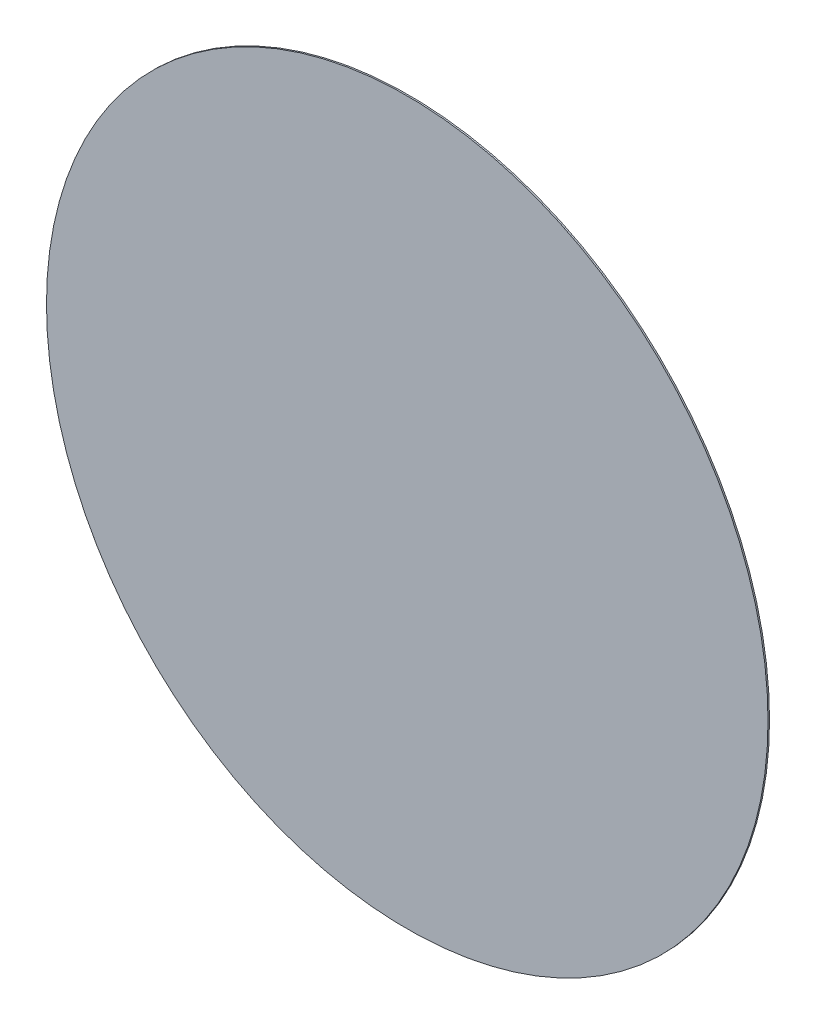
ISO-10303-21;
HEADER;
FILE_DESCRIPTION(('STEP AP214'),'2;1');
FILE_NAME('part.step','',(''),(''),'','','');
FILE_SCHEMA(('AUTOMOTIVE_DESIGN { 1 0 10303 214 1 1 1 1 }'));
ENDSEC;
DATA;
#1=APPLICATION_CONTEXT('core data for automotive mechanical design processes');
#2=APPLICATION_PROTOCOL_DEFINITION('international standard','automotive_design',2000,#1);
#3=PRODUCT_CONTEXT('',#1,'mechanical');
#4=PRODUCT('Part','Part','',(#3));
#5=PRODUCT_RELATED_PRODUCT_CATEGORY('part','',(#4));
#6=PRODUCT_DEFINITION_FORMATION('','',#4);
#7=PRODUCT_DEFINITION_CONTEXT('part definition',#1,'design');
#8=PRODUCT_DEFINITION('design','',#6,#7);
#9=PRODUCT_DEFINITION_SHAPE('','',#8);
#10=(LENGTH_UNIT() NAMED_UNIT(*) SI_UNIT(.MILLI.,.METRE.));
#11=(NAMED_UNIT(*) PLANE_ANGLE_UNIT() SI_UNIT($,.RADIAN.));
#12=(NAMED_UNIT(*) SI_UNIT($,.STERADIAN.) SOLID_ANGLE_UNIT());
#13=UNCERTAINTY_MEASURE_WITH_UNIT(LENGTH_MEASURE(1.E-05),#10,'distance_accuracy_value','');
#14=(GEOMETRIC_REPRESENTATION_CONTEXT(3) GLOBAL_UNCERTAINTY_ASSIGNED_CONTEXT((#13)) GLOBAL_UNIT_ASSIGNED_CONTEXT((#10,
#11,#12)) REPRESENTATION_CONTEXT('',''));
#15=CARTESIAN_POINT('',(0.,0.,0.));
#16=DIRECTION('',(0.,0.,1.));
#17=DIRECTION('',(1.,0.,0.));
#18=AXIS2_PLACEMENT_3D('',#15,#16,#17);
#19=CARTESIAN_POINT('',(0.,0.,0.2));
#20=DIRECTION('',(0.,0.,-1.));
#21=DIRECTION('',(-1.,0.,0.));
#22=AXIS2_PLACEMENT_3D('',#19,#20,#21);
#23=CYLINDRICAL_SURFACE('',#22,47.75);
#24=CARTESIAN_POINT('',(0.,0.,0.2));
#25=DIRECTION('',(0.,0.,1.));
#26=DIRECTION('',(1.,0.,0.));
#27=AXIS2_PLACEMENT_3D('',#24,#25,#26);
#28=CIRCLE('',#27,47.75);
#29=CARTESIAN_POINT('',(47.75,0.,0.2));
#30=VERTEX_POINT('',#29);
#31=EDGE_CURVE('E10',#30,#30,#28,.T.);
#32=ORIENTED_EDGE('',*,*,#31,.F.);
#33=EDGE_LOOP('',(#32));
#34=FACE_BOUND('',#33,.T.);
#35=CARTESIAN_POINT('',(0.,0.,0.));
#36=DIRECTION('',(0.,0.,1.));
#37=DIRECTION('',(1.,0.,0.));
#38=AXIS2_PLACEMENT_3D('',#35,#36,#37);
#39=CIRCLE('',#38,47.75);
#40=CARTESIAN_POINT('',(47.75,0.,0.));
#41=VERTEX_POINT('',#40);
#42=EDGE_CURVE('E35',#41,#41,#39,.T.);
#43=ORIENTED_EDGE('',*,*,#42,.T.);
#44=EDGE_LOOP('',(#43));
#45=FACE_BOUND('',#44,.T.);
#46=ADVANCED_FACE('F32',(#34,#45),#23,.T.);
#47=CARTESIAN_POINT('',(0.,0.,0.2));
#48=DIRECTION('',(0.,0.,1.));
#49=DIRECTION('',(1.,0.,0.));
#50=AXIS2_PLACEMENT_3D('',#47,#48,#49);
#51=PLANE('',#50);
#52=ORIENTED_EDGE('',*,*,#31,.T.);
#53=EDGE_LOOP('',(#52));
#54=FACE_BOUND('',#53,.T.);
#55=ADVANCED_FACE('F47',(#54),#51,.T.);
#56=CARTESIAN_POINT('',(0.,0.,0.));
#57=DIRECTION('',(0.,0.,1.));
#58=DIRECTION('',(1.,0.,0.));
#59=AXIS2_PLACEMENT_3D('',#56,#57,#58);
#60=PLANE('',#59);
#61=ORIENTED_EDGE('',*,*,#42,.F.);
#62=EDGE_LOOP('',(#61));
#63=FACE_BOUND('',#62,.T.);
#64=ADVANCED_FACE('F45',(#63),#60,.F.);
#65=CLOSED_SHELL('',(#46,#55,#64));
#66=MANIFOLD_SOLID_BREP('B2',#65);
#67=ADVANCED_BREP_SHAPE_REPRESENTATION('',(#18,#66),#14);
#68=SHAPE_DEFINITION_REPRESENTATION(#9,#67);
ENDSEC;
END-ISO-10303-21;
